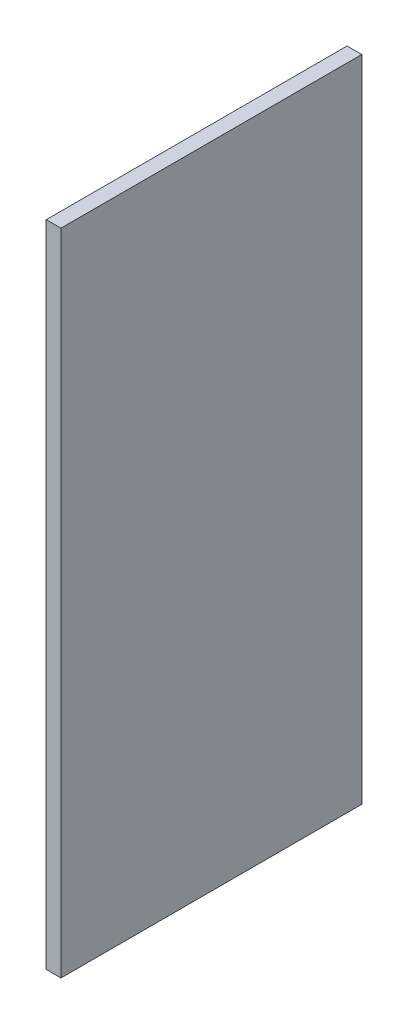
ISO-10303-21;
HEADER;
FILE_DESCRIPTION(('STEP AP214'),'2;1');
FILE_NAME('part.step','',(''),(''),'','','');
FILE_SCHEMA(('AUTOMOTIVE_DESIGN { 1 0 10303 214 1 1 1 1 }'));
ENDSEC;
DATA;
#1=APPLICATION_CONTEXT('core data for automotive mechanical design processes');
#2=APPLICATION_PROTOCOL_DEFINITION('international standard','automotive_design',2000,#1);
#3=PRODUCT_CONTEXT('',#1,'mechanical');
#4=PRODUCT('Part','Part','',(#3));
#5=PRODUCT_RELATED_PRODUCT_CATEGORY('part','',(#4));
#6=PRODUCT_DEFINITION_FORMATION('','',#4);
#7=PRODUCT_DEFINITION_CONTEXT('part definition',#1,'design');
#8=PRODUCT_DEFINITION('design','',#6,#7);
#9=PRODUCT_DEFINITION_SHAPE('','',#8);
#10=(LENGTH_UNIT() NAMED_UNIT(*) SI_UNIT(.MILLI.,.METRE.));
#11=(NAMED_UNIT(*) PLANE_ANGLE_UNIT() SI_UNIT($,.RADIAN.));
#12=(NAMED_UNIT(*) SI_UNIT($,.STERADIAN.) SOLID_ANGLE_UNIT());
#13=UNCERTAINTY_MEASURE_WITH_UNIT(LENGTH_MEASURE(1.E-05),#10,'distance_accuracy_value','');
#14=(GEOMETRIC_REPRESENTATION_CONTEXT(3) GLOBAL_UNCERTAINTY_ASSIGNED_CONTEXT((#13)) GLOBAL_UNIT_ASSIGNED_CONTEXT((#10,
#11,#12)) REPRESENTATION_CONTEXT('',''));
#15=CARTESIAN_POINT('',(0.,0.,0.));
#16=DIRECTION('',(0.,0.,1.));
#17=DIRECTION('',(1.,0.,0.));
#18=AXIS2_PLACEMENT_3D('',#15,#16,#17);
#19=CARTESIAN_POINT('',(1.5,201.5,-818.5));
#20=DIRECTION('',(-1.,0.,0.));
#21=DIRECTION('',(0.,0.,1.));
#22=AXIS2_PLACEMENT_3D('',#19,#20,#21);
#23=PLANE('',#22);
#24=DIRECTION('',(0.,-1.,0.));
#25=VECTOR('',#24,1.);
#26=CARTESIAN_POINT('',(1.5,201.5,0.));
#27=LINE('',#26,#25);
#28=CARTESIAN_POINT('',(1.5,1968.5,0.));
#29=VERTEX_POINT('',#28);
#30=CARTESIAN_POINT('',(1.5,201.5,0.));
#31=VERTEX_POINT('',#30);
#32=EDGE_CURVE('E103',#29,#31,#27,.T.);
#33=ORIENTED_EDGE('',*,*,#32,.F.);
#34=DIRECTION('',(0.,0.,1.));
#35=VECTOR('',#34,1.);
#36=CARTESIAN_POINT('',(1.5,1968.5,-818.5));
#37=LINE('',#36,#35);
#38=CARTESIAN_POINT('',(1.5,1968.5,-818.5));
#39=VERTEX_POINT('',#38);
#40=EDGE_CURVE('E11',#39,#29,#37,.T.);
#41=ORIENTED_EDGE('',*,*,#40,.F.);
#42=DIRECTION('',(0.,-1.,0.));
#43=VECTOR('',#42,1.);
#44=CARTESIAN_POINT('',(1.5,201.5,-818.5));
#45=LINE('',#44,#43);
#46=CARTESIAN_POINT('',(1.5,201.5,-818.5));
#47=VERTEX_POINT('',#46);
#48=EDGE_CURVE('E97',#39,#47,#45,.T.);
#49=ORIENTED_EDGE('',*,*,#48,.T.);
#50=DIRECTION('',(0.,0.,1.));
#51=VECTOR('',#50,1.);
#52=CARTESIAN_POINT('',(1.5,201.5,-818.5));
#53=LINE('',#52,#51);
#54=EDGE_CURVE('E42',#47,#31,#53,.T.);
#55=ORIENTED_EDGE('',*,*,#54,.T.);
#56=EDGE_LOOP('',(#33,#41,#49,#55));
#57=FACE_BOUND('',#56,.T.);
#58=ADVANCED_FACE('F39',(#57),#23,.T.);
#59=CARTESIAN_POINT('',(1.5,1968.5,-818.5));
#60=DIRECTION('',(0.,1.,0.));
#61=DIRECTION('',(0.,0.,1.));
#62=AXIS2_PLACEMENT_3D('',#59,#60,#61);
#63=PLANE('',#62);
#64=DIRECTION('',(-1.,0.,0.));
#65=VECTOR('',#64,1.);
#66=CARTESIAN_POINT('',(1.5,1968.5,0.));
#67=LINE('',#66,#65);
#68=CARTESIAN_POINT('',(41.5,1968.5,0.));
#69=VERTEX_POINT('',#68);
#70=EDGE_CURVE('E99',#69,#29,#67,.T.);
#71=ORIENTED_EDGE('',*,*,#70,.F.);
#72=DIRECTION('',(0.,0.,1.));
#73=VECTOR('',#72,1.);
#74=CARTESIAN_POINT('',(41.5,1968.5,-818.5));
#75=LINE('',#74,#73);
#76=CARTESIAN_POINT('',(41.5,1968.5,-818.5));
#77=VERTEX_POINT('',#76);
#78=EDGE_CURVE('E48',#77,#69,#75,.T.);
#79=ORIENTED_EDGE('',*,*,#78,.F.);
#80=DIRECTION('',(-1.,0.,0.));
#81=VECTOR('',#80,1.);
#82=CARTESIAN_POINT('',(1.5,1968.5,-818.5));
#83=LINE('',#82,#81);
#84=EDGE_CURVE('E94',#77,#39,#83,.T.);
#85=ORIENTED_EDGE('',*,*,#84,.T.);
#86=ORIENTED_EDGE('',*,*,#40,.T.);
#87=EDGE_LOOP('',(#71,#79,#85,#86));
#88=FACE_BOUND('',#87,.T.);
#89=ADVANCED_FACE('F113',(#88),#63,.T.);
#90=CARTESIAN_POINT('',(41.5,201.5,-818.5));
#91=DIRECTION('',(1.,0.,0.));
#92=DIRECTION('',(0.,0.,-1.));
#93=AXIS2_PLACEMENT_3D('',#90,#91,#92);
#94=PLANE('',#93);
#95=DIRECTION('',(0.,1.,0.));
#96=VECTOR('',#95,1.);
#97=CARTESIAN_POINT('',(41.5,201.5,0.));
#98=LINE('',#97,#96);
#99=CARTESIAN_POINT('',(41.5,201.5,0.));
#100=VERTEX_POINT('',#99);
#101=EDGE_CURVE('E89',#100,#69,#98,.T.);
#102=ORIENTED_EDGE('',*,*,#101,.F.);
#103=DIRECTION('',(0.,0.,1.));
#104=VECTOR('',#103,1.);
#105=CARTESIAN_POINT('',(41.5,201.5,-818.5));
#106=LINE('',#105,#104);
#107=CARTESIAN_POINT('',(41.5,201.5,-818.5));
#108=VERTEX_POINT('',#107);
#109=EDGE_CURVE('E84',#108,#100,#106,.T.);
#110=ORIENTED_EDGE('',*,*,#109,.F.);
#111=DIRECTION('',(0.,1.,0.));
#112=VECTOR('',#111,1.);
#113=CARTESIAN_POINT('',(41.5,201.5,-818.5));
#114=LINE('',#113,#112);
#115=EDGE_CURVE('E87',#108,#77,#114,.T.);
#116=ORIENTED_EDGE('',*,*,#115,.T.);
#117=ORIENTED_EDGE('',*,*,#78,.T.);
#118=EDGE_LOOP('',(#102,#110,#116,#117));
#119=FACE_BOUND('',#118,.T.);
#120=ADVANCED_FACE('F86',(#119),#94,.T.);
#121=CARTESIAN_POINT('',(1.5,201.5,-818.5));
#122=DIRECTION('',(0.,-1.,0.));
#123=DIRECTION('',(0.,0.,-1.));
#124=AXIS2_PLACEMENT_3D('',#121,#122,#123);
#125=PLANE('',#124);
#126=DIRECTION('',(1.,0.,0.));
#127=VECTOR('',#126,1.);
#128=CARTESIAN_POINT('',(1.5,201.5,0.));
#129=LINE('',#128,#127);
#130=EDGE_CURVE('E106',#31,#100,#129,.T.);
#131=ORIENTED_EDGE('',*,*,#130,.F.);
#132=ORIENTED_EDGE('',*,*,#54,.F.);
#133=DIRECTION('',(1.,0.,0.));
#134=VECTOR('',#133,1.);
#135=CARTESIAN_POINT('',(1.5,201.5,-818.5));
#136=LINE('',#135,#134);
#137=EDGE_CURVE('E93',#47,#108,#136,.T.);
#138=ORIENTED_EDGE('',*,*,#137,.T.);
#139=ORIENTED_EDGE('',*,*,#109,.T.);
#140=EDGE_LOOP('',(#131,#132,#138,#139));
#141=FACE_BOUND('',#140,.T.);
#142=ADVANCED_FACE('F96',(#141),#125,.T.);
#143=CARTESIAN_POINT('',(0.,0.,-818.5));
#144=DIRECTION('',(0.,0.,-1.));
#145=DIRECTION('',(-1.,0.,0.));
#146=AXIS2_PLACEMENT_3D('',#143,#144,#145);
#147=PLANE('',#146);
#148=ORIENTED_EDGE('',*,*,#48,.F.);
#149=ORIENTED_EDGE('',*,*,#84,.F.);
#150=ORIENTED_EDGE('',*,*,#115,.F.);
#151=ORIENTED_EDGE('',*,*,#137,.F.);
#152=EDGE_LOOP('',(#148,#149,#150,#151));
#153=FACE_BOUND('',#152,.T.);
#154=ADVANCED_FACE('F92',(#153),#147,.T.);
#155=CARTESIAN_POINT('',(0.,0.,0.));
#156=DIRECTION('',(0.,0.,-1.));
#157=DIRECTION('',(-1.,0.,0.));
#158=AXIS2_PLACEMENT_3D('',#155,#156,#157);
#159=PLANE('',#158);
#160=ORIENTED_EDGE('',*,*,#32,.T.);
#161=ORIENTED_EDGE('',*,*,#130,.T.);
#162=ORIENTED_EDGE('',*,*,#101,.T.);
#163=ORIENTED_EDGE('',*,*,#70,.T.);
#164=EDGE_LOOP('',(#160,#161,#162,#163));
#165=FACE_BOUND('',#164,.T.);
#166=ADVANCED_FACE('F112',(#165),#159,.F.);
#167=CLOSED_SHELL('',(#58,#89,#120,#142,#154,#166));
#168=MANIFOLD_SOLID_BREP('B2',#167);
#169=ADVANCED_BREP_SHAPE_REPRESENTATION('',(#18,#168),#14);
#170=SHAPE_DEFINITION_REPRESENTATION(#9,#169);
ENDSEC;
END-ISO-10303-21;
